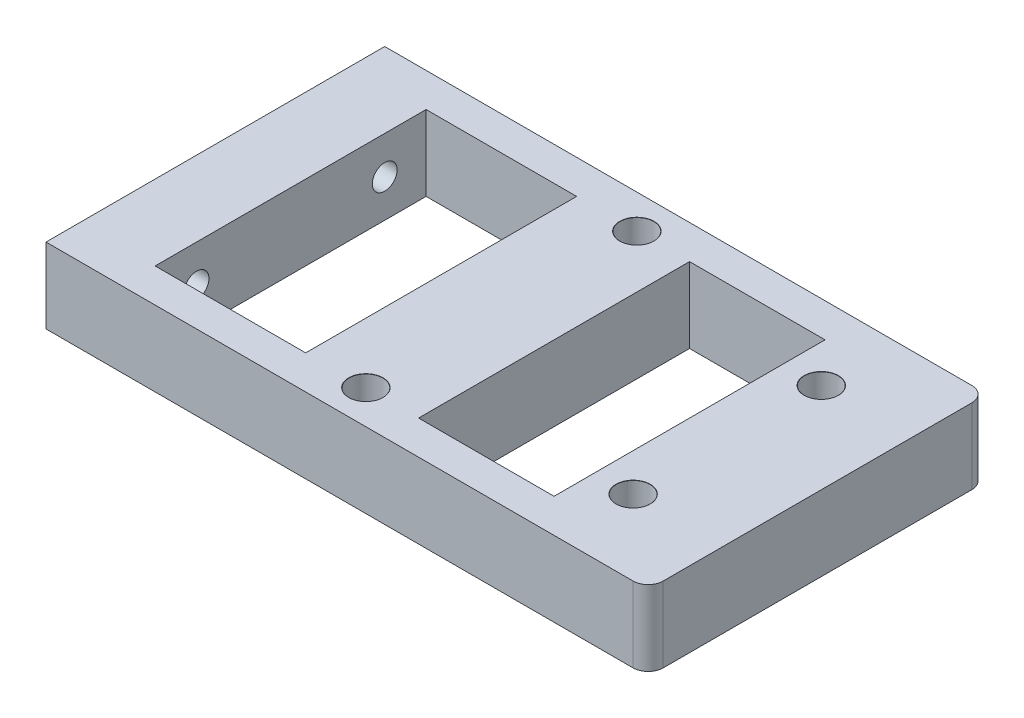
ISO-10303-21;
HEADER;
FILE_DESCRIPTION(('STEP AP214'),'2;1');
FILE_NAME('part.step','',(''),(''),'','','');
FILE_SCHEMA(('AUTOMOTIVE_DESIGN { 1 0 10303 214 1 1 1 1 }'));
ENDSEC;
DATA;
#1=APPLICATION_CONTEXT('core data for automotive mechanical design processes');
#2=APPLICATION_PROTOCOL_DEFINITION('international standard','automotive_design',2000,#1);
#3=PRODUCT_CONTEXT('',#1,'mechanical');
#4=PRODUCT('Part','Part','',(#3));
#5=PRODUCT_RELATED_PRODUCT_CATEGORY('part','',(#4));
#6=PRODUCT_DEFINITION_FORMATION('','',#4);
#7=PRODUCT_DEFINITION_CONTEXT('part definition',#1,'design');
#8=PRODUCT_DEFINITION('design','',#6,#7);
#9=PRODUCT_DEFINITION_SHAPE('','',#8);
#10=(LENGTH_UNIT() NAMED_UNIT(*) SI_UNIT(.MILLI.,.METRE.));
#11=(NAMED_UNIT(*) PLANE_ANGLE_UNIT() SI_UNIT($,.RADIAN.));
#12=(NAMED_UNIT(*) SI_UNIT($,.STERADIAN.) SOLID_ANGLE_UNIT());
#13=UNCERTAINTY_MEASURE_WITH_UNIT(LENGTH_MEASURE(1.E-05),#10,'distance_accuracy_value','');
#14=(GEOMETRIC_REPRESENTATION_CONTEXT(3) GLOBAL_UNCERTAINTY_ASSIGNED_CONTEXT((#13)) GLOBAL_UNIT_ASSIGNED_CONTEXT((#10,
#11,#12)) REPRESENTATION_CONTEXT('',''));
#15=CARTESIAN_POINT('',(0.,0.,0.));
#16=DIRECTION('',(0.,0.,1.));
#17=DIRECTION('',(1.,0.,0.));
#18=AXIS2_PLACEMENT_3D('',#15,#16,#17);
#19=CARTESIAN_POINT('',(0.,10.,0.));
#20=DIRECTION('',(0.,1.,0.));
#21=DIRECTION('',(0.,0.,1.));
#22=AXIS2_PLACEMENT_3D('',#19,#20,#21);
#23=PLANE('',#22);
#24=DIRECTION('',(1.,0.,0.));
#25=VECTOR('',#24,1.);
#26=CARTESIAN_POINT('',(0.,10.,18.));
#27=LINE('',#26,#25);
#28=CARTESIAN_POINT('',(-7.5,10.,18.));
#29=VERTEX_POINT('',#28);
#30=CARTESIAN_POINT('',(10.5,10.,18.));
#31=VERTEX_POINT('',#30);
#32=EDGE_CURVE('E59',#29,#31,#27,.T.);
#33=ORIENTED_EDGE('',*,*,#32,.F.);
#34=DIRECTION('',(0.,0.,-1.));
#35=VECTOR('',#34,1.);
#36=CARTESIAN_POINT('',(-7.5,10.,0.));
#37=LINE('',#36,#35);
#38=CARTESIAN_POINT('',(-7.5,10.,-18.));
#39=VERTEX_POINT('',#38);
#40=EDGE_CURVE('E169',#29,#39,#37,.T.);
#41=ORIENTED_EDGE('',*,*,#40,.T.);
#42=DIRECTION('',(1.,0.,0.));
#43=VECTOR('',#42,1.);
#44=CARTESIAN_POINT('',(0.,10.,-18.));
#45=LINE('',#44,#43);
#46=CARTESIAN_POINT('',(10.5,10.,-18.));
#47=VERTEX_POINT('',#46);
#48=EDGE_CURVE('E174',#39,#47,#45,.T.);
#49=ORIENTED_EDGE('',*,*,#48,.T.);
#50=DIRECTION('',(0.,0.,-1.));
#51=VECTOR('',#50,1.);
#52=CARTESIAN_POINT('',(10.5,10.,0.));
#53=LINE('',#52,#51);
#54=EDGE_CURVE('E183',#31,#47,#53,.T.);
#55=ORIENTED_EDGE('',*,*,#54,.F.);
#56=EDGE_LOOP('',(#33,#41,#49,#55));
#57=FACE_BOUND('',#56,.T.);
#58=CARTESIAN_POINT('',(-14.5,10.,-18.));
#59=DIRECTION('',(0.,1.,0.));
#60=DIRECTION('',(0.,0.,1.));
#61=AXIS2_PLACEMENT_3D('',#58,#59,#60);
#62=CIRCLE('',#61,2.275);
#63=CARTESIAN_POINT('',(-14.5,10.,-15.725));
#64=VERTEX_POINT('',#63);
#65=EDGE_CURVE('E261',#64,#64,#62,.T.);
#66=ORIENTED_EDGE('',*,*,#65,.F.);
#67=EDGE_LOOP('',(#66));
#68=FACE_BOUND('',#67,.T.);
#69=CARTESIAN_POINT('',(15.5,10.,-12.5));
#70=DIRECTION('',(0.,1.,0.));
#71=DIRECTION('',(0.,0.,1.));
#72=AXIS2_PLACEMENT_3D('',#69,#70,#71);
#73=CIRCLE('',#72,2.275);
#74=CARTESIAN_POINT('',(15.5,10.,-10.225));
#75=VERTEX_POINT('',#74);
#76=EDGE_CURVE('E273',#75,#75,#73,.T.);
#77=ORIENTED_EDGE('',*,*,#76,.F.);
#78=EDGE_LOOP('',(#77));
#79=FACE_BOUND('',#78,.T.);
#80=CARTESIAN_POINT('',(15.5,10.,12.5));
#81=DIRECTION('',(0.,1.,0.));
#82=DIRECTION('',(0.,0.,1.));
#83=AXIS2_PLACEMENT_3D('',#80,#81,#82);
#84=CIRCLE('',#83,2.275);
#85=CARTESIAN_POINT('',(15.5,10.,14.775));
#86=VERTEX_POINT('',#85);
#87=EDGE_CURVE('E285',#86,#86,#84,.T.);
#88=ORIENTED_EDGE('',*,*,#87,.F.);
#89=EDGE_LOOP('',(#88));
#90=FACE_BOUND('',#89,.T.);
#91=CARTESIAN_POINT('',(-14.5,10.,18.));
#92=DIRECTION('',(0.,1.,0.));
#93=DIRECTION('',(0.,0.,1.));
#94=AXIS2_PLACEMENT_3D('',#91,#92,#93);
#95=CIRCLE('',#94,2.275);
#96=CARTESIAN_POINT('',(-14.5,10.,20.275));
#97=VERTEX_POINT('',#96);
#98=EDGE_CURVE('E297',#97,#97,#95,.T.);
#99=ORIENTED_EDGE('',*,*,#98,.F.);
#100=EDGE_LOOP('',(#99));
#101=FACE_BOUND('',#100,.T.);
#102=DIRECTION('',(1.,0.,0.));
#103=VECTOR('',#102,1.);
#104=CARTESIAN_POINT('',(-52.5,10.,22.5));
#105=LINE('',#104,#103);
#106=CARTESIAN_POINT('',(-52.5,10.,22.5));
#107=VERTEX_POINT('',#106);
#108=CARTESIAN_POINT('',(25.5,10.,22.5));
#109=VERTEX_POINT('',#108);
#110=EDGE_CURVE('E321',#107,#109,#105,.T.);
#111=ORIENTED_EDGE('',*,*,#110,.T.);
#112=CARTESIAN_POINT('',(25.5,10.,20.5));
#113=DIRECTION('',(0.,1.,0.));
#114=DIRECTION('',(0.,0.,1.));
#115=AXIS2_PLACEMENT_3D('',#112,#113,#114);
#116=CIRCLE('',#115,2.);
#117=CARTESIAN_POINT('',(27.5,10.,20.5));
#118=VERTEX_POINT('',#117);
#119=EDGE_CURVE('E52',#109,#118,#116,.T.);
#120=ORIENTED_EDGE('',*,*,#119,.T.);
#121=DIRECTION('',(0.,0.,-1.));
#122=VECTOR('',#121,1.);
#123=CARTESIAN_POINT('',(27.5,10.,-22.5));
#124=LINE('',#123,#122);
#125=CARTESIAN_POINT('',(27.5,10.,-20.5));
#126=VERTEX_POINT('',#125);
#127=EDGE_CURVE('E310',#118,#126,#124,.T.);
#128=ORIENTED_EDGE('',*,*,#127,.T.);
#129=CARTESIAN_POINT('',(25.5,10.,-20.5));
#130=DIRECTION('',(0.,1.,0.));
#131=DIRECTION('',(0.,0.,1.));
#132=AXIS2_PLACEMENT_3D('',#129,#130,#131);
#133=CIRCLE('',#132,2.);
#134=CARTESIAN_POINT('',(25.5,10.,-22.5));
#135=VERTEX_POINT('',#134);
#136=EDGE_CURVE('E362',#126,#135,#133,.T.);
#137=ORIENTED_EDGE('',*,*,#136,.T.);
#138=DIRECTION('',(-1.,0.,0.));
#139=VECTOR('',#138,1.);
#140=CARTESIAN_POINT('',(-27.5,10.,-22.5));
#141=LINE('',#140,#139);
#142=CARTESIAN_POINT('',(-52.5,10.,-22.5));
#143=VERTEX_POINT('',#142);
#144=EDGE_CURVE('E314',#135,#143,#141,.T.);
#145=ORIENTED_EDGE('',*,*,#144,.T.);
#146=DIRECTION('',(0.,0.,1.));
#147=VECTOR('',#146,1.);
#148=CARTESIAN_POINT('',(-52.5,10.,-22.5));
#149=LINE('',#148,#147);
#150=EDGE_CURVE('E318',#143,#107,#149,.T.);
#151=ORIENTED_EDGE('',*,*,#150,.T.);
#152=EDGE_LOOP('',(#111,#120,#128,#137,#145,#151));
#153=FACE_BOUND('',#152,.T.);
#154=DIRECTION('',(-1.,0.,0.));
#155=VECTOR('',#154,1.);
#156=CARTESIAN_POINT('',(-22.5,10.,-18.));
#157=LINE('',#156,#155);
#158=CARTESIAN_POINT('',(-22.5,10.,-18.));
#159=VERTEX_POINT('',#158);
#160=CARTESIAN_POINT('',(-42.5,10.,-18.));
#161=VERTEX_POINT('',#160);
#162=EDGE_CURVE('E211',#159,#161,#157,.T.);
#163=ORIENTED_EDGE('',*,*,#162,.F.);
#164=DIRECTION('',(0.,0.,1.));
#165=VECTOR('',#164,1.);
#166=CARTESIAN_POINT('',(-22.5,10.,-18.));
#167=LINE('',#166,#165);
#168=CARTESIAN_POINT('',(-22.5,10.,18.));
#169=VERTEX_POINT('',#168);
#170=EDGE_CURVE('E67',#159,#169,#167,.T.);
#171=ORIENTED_EDGE('',*,*,#170,.T.);
#172=DIRECTION('',(-1.,0.,0.));
#173=VECTOR('',#172,1.);
#174=CARTESIAN_POINT('',(-22.5,10.,18.));
#175=LINE('',#174,#173);
#176=CARTESIAN_POINT('',(-42.5,10.,18.));
#177=VERTEX_POINT('',#176);
#178=EDGE_CURVE('E220',#169,#177,#175,.T.);
#179=ORIENTED_EDGE('',*,*,#178,.T.);
#180=DIRECTION('',(0.,0.,1.));
#181=VECTOR('',#180,1.);
#182=CARTESIAN_POINT('',(-42.5,10.,-18.));
#183=LINE('',#182,#181);
#184=EDGE_CURVE('E215',#161,#177,#183,.T.);
#185=ORIENTED_EDGE('',*,*,#184,.F.);
#186=EDGE_LOOP('',(#163,#171,#179,#185));
#187=FACE_BOUND('',#186,.T.);
#188=ADVANCED_FACE('F43',(#57,#68,#79,#90,#101,#153,#187),#23,.T.);
#189=CARTESIAN_POINT('',(0.,0.,0.));
#190=DIRECTION('',(0.,1.,0.));
#191=DIRECTION('',(0.,0.,1.));
#192=AXIS2_PLACEMENT_3D('',#189,#190,#191);
#193=PLANE('',#192);
#194=DIRECTION('',(0.,0.,-1.));
#195=VECTOR('',#194,1.);
#196=CARTESIAN_POINT('',(-7.5,0.,0.));
#197=LINE('',#196,#195);
#198=CARTESIAN_POINT('',(-7.5,0.,18.));
#199=VERTEX_POINT('',#198);
#200=CARTESIAN_POINT('',(-7.5,0.,-18.));
#201=VERTEX_POINT('',#200);
#202=EDGE_CURVE('E155',#199,#201,#197,.T.);
#203=ORIENTED_EDGE('',*,*,#202,.F.);
#204=DIRECTION('',(1.,0.,0.));
#205=VECTOR('',#204,1.);
#206=CARTESIAN_POINT('',(0.,0.,18.));
#207=LINE('',#206,#205);
#208=CARTESIAN_POINT('',(10.5,0.,18.));
#209=VERTEX_POINT('',#208);
#210=EDGE_CURVE('E148',#199,#209,#207,.T.);
#211=ORIENTED_EDGE('',*,*,#210,.T.);
#212=DIRECTION('',(0.,0.,-1.));
#213=VECTOR('',#212,1.);
#214=CARTESIAN_POINT('',(10.5,0.,0.));
#215=LINE('',#214,#213);
#216=CARTESIAN_POINT('',(10.5,0.,-18.));
#217=VERTEX_POINT('',#216);
#218=EDGE_CURVE('E158',#209,#217,#215,.T.);
#219=ORIENTED_EDGE('',*,*,#218,.T.);
#220=DIRECTION('',(1.,0.,0.));
#221=VECTOR('',#220,1.);
#222=CARTESIAN_POINT('',(0.,0.,-18.));
#223=LINE('',#222,#221);
#224=EDGE_CURVE('E164',#201,#217,#223,.T.);
#225=ORIENTED_EDGE('',*,*,#224,.F.);
#226=EDGE_LOOP('',(#203,#211,#219,#225));
#227=FACE_BOUND('',#226,.T.);
#228=DIRECTION('',(0.,0.,-1.));
#229=VECTOR('',#228,1.);
#230=CARTESIAN_POINT('',(27.5,0.,-22.5));
#231=LINE('',#230,#229);
#232=CARTESIAN_POINT('',(27.5,0.,20.5));
#233=VERTEX_POINT('',#232);
#234=CARTESIAN_POINT('',(27.5,0.,-20.5));
#235=VERTEX_POINT('',#234);
#236=EDGE_CURVE('E309',#233,#235,#231,.T.);
#237=ORIENTED_EDGE('',*,*,#236,.F.);
#238=CARTESIAN_POINT('',(25.5,0.,20.5));
#239=DIRECTION('',(0.,1.,0.));
#240=DIRECTION('',(0.,0.,1.));
#241=AXIS2_PLACEMENT_3D('',#238,#239,#240);
#242=CIRCLE('',#241,2.);
#243=CARTESIAN_POINT('',(25.5,0.,22.5));
#244=VERTEX_POINT('',#243);
#245=EDGE_CURVE('E356',#233,#244,#242,.F.);
#246=ORIENTED_EDGE('',*,*,#245,.T.);
#247=DIRECTION('',(1.,0.,0.));
#248=VECTOR('',#247,1.);
#249=CARTESIAN_POINT('',(-27.5,0.,22.5));
#250=LINE('',#249,#248);
#251=CARTESIAN_POINT('',(-52.5,0.,22.5));
#252=VERTEX_POINT('',#251);
#253=EDGE_CURVE('E315',#252,#244,#250,.T.);
#254=ORIENTED_EDGE('',*,*,#253,.F.);
#255=DIRECTION('',(0.,0.,1.));
#256=VECTOR('',#255,1.);
#257=CARTESIAN_POINT('',(-52.5,0.,-22.5));
#258=LINE('',#257,#256);
#259=CARTESIAN_POINT('',(-52.5,0.,-22.5));
#260=VERTEX_POINT('',#259);
#261=EDGE_CURVE('E332',#260,#252,#258,.T.);
#262=ORIENTED_EDGE('',*,*,#261,.F.);
#263=DIRECTION('',(-1.,0.,0.));
#264=VECTOR('',#263,1.);
#265=CARTESIAN_POINT('',(-27.5,0.,-22.5));
#266=LINE('',#265,#264);
#267=CARTESIAN_POINT('',(25.5,0.,-22.5));
#268=VERTEX_POINT('',#267);
#269=EDGE_CURVE('E329',#268,#260,#266,.T.);
#270=ORIENTED_EDGE('',*,*,#269,.F.);
#271=CARTESIAN_POINT('',(25.5,0.,-20.5));
#272=DIRECTION('',(0.,1.,0.));
#273=DIRECTION('',(0.,0.,1.));
#274=AXIS2_PLACEMENT_3D('',#271,#272,#273);
#275=CIRCLE('',#274,2.);
#276=EDGE_CURVE('E353',#268,#235,#275,.F.);
#277=ORIENTED_EDGE('',*,*,#276,.T.);
#278=EDGE_LOOP('',(#237,#246,#254,#262,#270,#277));
#279=FACE_BOUND('',#278,.T.);
#280=CARTESIAN_POINT('',(-14.5,0.,18.));
#281=DIRECTION('',(0.,1.,0.));
#282=DIRECTION('',(0.,0.,1.));
#283=AXIS2_PLACEMENT_3D('',#280,#281,#282);
#284=CIRCLE('',#283,2.25);
#285=CARTESIAN_POINT('',(-14.5,0.,20.25));
#286=VERTEX_POINT('',#285);
#287=EDGE_CURVE('E305',#286,#286,#284,.T.);
#288=ORIENTED_EDGE('',*,*,#287,.T.);
#289=EDGE_LOOP('',(#288));
#290=FACE_BOUND('',#289,.T.);
#291=CARTESIAN_POINT('',(15.5,0.,12.5));
#292=DIRECTION('',(0.,1.,0.));
#293=DIRECTION('',(0.,0.,1.));
#294=AXIS2_PLACEMENT_3D('',#291,#292,#293);
#295=CIRCLE('',#294,2.25);
#296=CARTESIAN_POINT('',(15.5,0.,14.75));
#297=VERTEX_POINT('',#296);
#298=EDGE_CURVE('E293',#297,#297,#295,.T.);
#299=ORIENTED_EDGE('',*,*,#298,.T.);
#300=EDGE_LOOP('',(#299));
#301=FACE_BOUND('',#300,.T.);
#302=CARTESIAN_POINT('',(15.5,0.,-12.5));
#303=DIRECTION('',(0.,1.,0.));
#304=DIRECTION('',(0.,0.,1.));
#305=AXIS2_PLACEMENT_3D('',#302,#303,#304);
#306=CIRCLE('',#305,2.25);
#307=CARTESIAN_POINT('',(15.5,0.,-10.25));
#308=VERTEX_POINT('',#307);
#309=EDGE_CURVE('E281',#308,#308,#306,.T.);
#310=ORIENTED_EDGE('',*,*,#309,.T.);
#311=EDGE_LOOP('',(#310));
#312=FACE_BOUND('',#311,.T.);
#313=CARTESIAN_POINT('',(-14.5,0.,-18.));
#314=DIRECTION('',(0.,1.,0.));
#315=DIRECTION('',(0.,0.,1.));
#316=AXIS2_PLACEMENT_3D('',#313,#314,#315);
#317=CIRCLE('',#316,2.25);
#318=CARTESIAN_POINT('',(-14.5,0.,-15.75));
#319=VERTEX_POINT('',#318);
#320=EDGE_CURVE('E269',#319,#319,#317,.T.);
#321=ORIENTED_EDGE('',*,*,#320,.T.);
#322=EDGE_LOOP('',(#321));
#323=FACE_BOUND('',#322,.T.);
#324=DIRECTION('',(0.,0.,1.));
#325=VECTOR('',#324,1.);
#326=CARTESIAN_POINT('',(-22.5,0.,-18.));
#327=LINE('',#326,#325);
#328=CARTESIAN_POINT('',(-22.5,0.,-18.));
#329=VERTEX_POINT('',#328);
#330=CARTESIAN_POINT('',(-22.5,0.,18.));
#331=VERTEX_POINT('',#330);
#332=EDGE_CURVE('E216',#329,#331,#327,.T.);
#333=ORIENTED_EDGE('',*,*,#332,.F.);
#334=DIRECTION('',(-1.,0.,0.));
#335=VECTOR('',#334,1.);
#336=CARTESIAN_POINT('',(-22.5,0.,-18.));
#337=LINE('',#336,#335);
#338=CARTESIAN_POINT('',(-42.5,0.,-18.));
#339=VERTEX_POINT('',#338);
#340=EDGE_CURVE('E210',#329,#339,#337,.T.);
#341=ORIENTED_EDGE('',*,*,#340,.T.);
#342=DIRECTION('',(0.,0.,1.));
#343=VECTOR('',#342,1.);
#344=CARTESIAN_POINT('',(-42.5,0.,-18.));
#345=LINE('',#344,#343);
#346=CARTESIAN_POINT('',(-42.5,0.,18.));
#347=VERTEX_POINT('',#346);
#348=EDGE_CURVE('E229',#339,#347,#345,.T.);
#349=ORIENTED_EDGE('',*,*,#348,.T.);
#350=DIRECTION('',(-1.,0.,0.));
#351=VECTOR('',#350,1.);
#352=CARTESIAN_POINT('',(-22.5,0.,18.));
#353=LINE('',#352,#351);
#354=EDGE_CURVE('E233',#331,#347,#353,.T.);
#355=ORIENTED_EDGE('',*,*,#354,.F.);
#356=EDGE_LOOP('',(#333,#341,#349,#355));
#357=FACE_BOUND('',#356,.T.);
#358=ADVANCED_FACE('F166',(#227,#279,#290,#301,#312,#323,#357),#193,.F.);
#359=CARTESIAN_POINT('',(27.5,10.,-22.5));
#360=DIRECTION('',(-1.,0.,0.));
#361=DIRECTION('',(0.,0.,1.));
#362=AXIS2_PLACEMENT_3D('',#359,#360,#361);
#363=PLANE('',#362);
#364=ORIENTED_EDGE('',*,*,#127,.F.);
#365=DIRECTION('',(0.,-1.,0.));
#366=VECTOR('',#365,1.);
#367=CARTESIAN_POINT('',(27.5,10.,20.5));
#368=LINE('',#367,#366);
#369=EDGE_CURVE('E349',#118,#233,#368,.T.);
#370=ORIENTED_EDGE('',*,*,#369,.T.);
#371=ORIENTED_EDGE('',*,*,#236,.T.);
#372=DIRECTION('',(0.,-1.,0.));
#373=VECTOR('',#372,1.);
#374=CARTESIAN_POINT('',(27.5,10.,-20.5));
#375=LINE('',#374,#373);
#376=EDGE_CURVE('E346',#235,#126,#375,.F.);
#377=ORIENTED_EDGE('',*,*,#376,.T.);
#378=EDGE_LOOP('',(#364,#370,#371,#377));
#379=FACE_BOUND('',#378,.T.);
#380=ADVANCED_FACE('F376',(#379),#363,.F.);
#381=CARTESIAN_POINT('',(-27.5,10.,-22.5));
#382=DIRECTION('',(0.,0.,1.));
#383=DIRECTION('',(1.,0.,0.));
#384=AXIS2_PLACEMENT_3D('',#381,#382,#383);
#385=PLANE('',#384);
#386=ORIENTED_EDGE('',*,*,#144,.F.);
#387=DIRECTION('',(0.,-1.,0.));
#388=VECTOR('',#387,1.);
#389=CARTESIAN_POINT('',(25.5,10.,-22.5));
#390=LINE('',#389,#388);
#391=EDGE_CURVE('E11',#135,#268,#390,.T.);
#392=ORIENTED_EDGE('',*,*,#391,.T.);
#393=ORIENTED_EDGE('',*,*,#269,.T.);
#394=DIRECTION('',(0.,-1.,0.));
#395=VECTOR('',#394,1.);
#396=CARTESIAN_POINT('',(-52.5,10.,-22.5));
#397=LINE('',#396,#395);
#398=EDGE_CURVE('E342',#143,#260,#397,.T.);
#399=ORIENTED_EDGE('',*,*,#398,.F.);
#400=EDGE_LOOP('',(#386,#392,#393,#399));
#401=FACE_BOUND('',#400,.T.);
#402=ADVANCED_FACE('F392',(#401),#385,.F.);
#403=CARTESIAN_POINT('',(-52.5,10.,-22.5));
#404=DIRECTION('',(1.,0.,0.));
#405=DIRECTION('',(0.,0.,-1.));
#406=AXIS2_PLACEMENT_3D('',#403,#404,#405);
#407=PLANE('',#406);
#408=CARTESIAN_POINT('',(-52.5,5.,12.5));
#409=DIRECTION('',(-1.,0.,0.));
#410=DIRECTION('',(0.,0.,1.));
#411=AXIS2_PLACEMENT_3D('',#408,#409,#410);
#412=CIRCLE('',#411,2.025);
#413=CARTESIAN_POINT('',(-52.5,5.,14.525));
#414=VERTEX_POINT('',#413);
#415=EDGE_CURVE('E245',#414,#414,#412,.T.);
#416=ORIENTED_EDGE('',*,*,#415,.F.);
#417=EDGE_LOOP('',(#416));
#418=FACE_BOUND('',#417,.T.);
#419=CARTESIAN_POINT('',(-52.5,5.,-12.5));
#420=DIRECTION('',(-1.,0.,0.));
#421=DIRECTION('',(0.,0.,1.));
#422=AXIS2_PLACEMENT_3D('',#419,#420,#421);
#423=CIRCLE('',#422,2.025);
#424=CARTESIAN_POINT('',(-52.5,5.,-10.475));
#425=VERTEX_POINT('',#424);
#426=EDGE_CURVE('E253',#425,#425,#423,.T.);
#427=ORIENTED_EDGE('',*,*,#426,.F.);
#428=EDGE_LOOP('',(#427));
#429=FACE_BOUND('',#428,.T.);
#430=ORIENTED_EDGE('',*,*,#261,.T.);
#431=DIRECTION('',(0.,-1.,0.));
#432=VECTOR('',#431,1.);
#433=CARTESIAN_POINT('',(-52.5,10.,22.5));
#434=LINE('',#433,#432);
#435=EDGE_CURVE('E325',#107,#252,#434,.T.);
#436=ORIENTED_EDGE('',*,*,#435,.F.);
#437=ORIENTED_EDGE('',*,*,#150,.F.);
#438=ORIENTED_EDGE('',*,*,#398,.T.);
#439=EDGE_LOOP('',(#430,#436,#437,#438));
#440=FACE_BOUND('',#439,.T.);
#441=ADVANCED_FACE('F387',(#418,#429,#440),#407,.F.);
#442=CARTESIAN_POINT('',(-27.5,10.,22.5));
#443=DIRECTION('',(0.,0.,-1.));
#444=DIRECTION('',(-1.,0.,0.));
#445=AXIS2_PLACEMENT_3D('',#442,#443,#444);
#446=PLANE('',#445);
#447=ORIENTED_EDGE('',*,*,#253,.T.);
#448=DIRECTION('',(0.,-1.,0.));
#449=VECTOR('',#448,1.);
#450=CARTESIAN_POINT('',(25.5,10.,22.5));
#451=LINE('',#450,#449);
#452=EDGE_CURVE('E359',#244,#109,#451,.F.);
#453=ORIENTED_EDGE('',*,*,#452,.T.);
#454=ORIENTED_EDGE('',*,*,#110,.F.);
#455=ORIENTED_EDGE('',*,*,#435,.T.);
#456=EDGE_LOOP('',(#447,#453,#454,#455));
#457=FACE_BOUND('',#456,.T.);
#458=ADVANCED_FACE('F383',(#457),#446,.F.);
#459=CARTESIAN_POINT('',(-14.5,10.,18.));
#460=DIRECTION('',(0.,1.,0.));
#461=DIRECTION('',(0.,0.,1.));
#462=AXIS2_PLACEMENT_3D('',#459,#460,#461);
#463=CYLINDRICAL_SURFACE('',#462,2.25);
#464=ORIENTED_EDGE('',*,*,#287,.F.);
#465=EDGE_LOOP('',(#464));
#466=FACE_BOUND('',#465,.T.);
#467=CARTESIAN_POINT('',(-14.5,9.97902250922057,18.));
#468=DIRECTION('',(0.,1.,0.));
#469=DIRECTION('',(0.,0.,1.));
#470=AXIS2_PLACEMENT_3D('',#467,#468,#469);
#471=CIRCLE('',#470,2.25);
#472=CARTESIAN_POINT('',(-14.5,9.97902250922057,20.25));
#473=VERTEX_POINT('',#472);
#474=EDGE_CURVE('E301',#473,#473,#471,.T.);
#475=ORIENTED_EDGE('',*,*,#474,.T.);
#476=EDGE_LOOP('',(#475));
#477=FACE_BOUND('',#476,.T.);
#478=ADVANCED_FACE('F414',(#466,#477),#463,.F.);
#479=CARTESIAN_POINT('',(-14.5,10.,18.));
#480=DIRECTION('',(0.,1.,0.));
#481=DIRECTION('',(0.,0.,1.));
#482=AXIS2_PLACEMENT_3D('',#479,#480,#481);
#483=CONICAL_SURFACE('',#482,2.275,0.872664625997159);
#484=ORIENTED_EDGE('',*,*,#474,.F.);
#485=EDGE_LOOP('',(#484));
#486=FACE_BOUND('',#485,.T.);
#487=ORIENTED_EDGE('',*,*,#98,.T.);
#488=EDGE_LOOP('',(#487));
#489=FACE_BOUND('',#488,.T.);
#490=ADVANCED_FACE('F575',(#486,#489),#483,.F.);
#491=CARTESIAN_POINT('',(15.5,10.,12.5));
#492=DIRECTION('',(0.,1.,0.));
#493=DIRECTION('',(0.,0.,1.));
#494=AXIS2_PLACEMENT_3D('',#491,#492,#493);
#495=CYLINDRICAL_SURFACE('',#494,2.25);
#496=ORIENTED_EDGE('',*,*,#298,.F.);
#497=EDGE_LOOP('',(#496));
#498=FACE_BOUND('',#497,.T.);
#499=CARTESIAN_POINT('',(15.5,9.97902250922057,12.5));
#500=DIRECTION('',(0.,1.,0.));
#501=DIRECTION('',(0.,0.,1.));
#502=AXIS2_PLACEMENT_3D('',#499,#500,#501);
#503=CIRCLE('',#502,2.25);
#504=CARTESIAN_POINT('',(15.5,9.97902250922057,14.75));
#505=VERTEX_POINT('',#504);
#506=EDGE_CURVE('E289',#505,#505,#503,.T.);
#507=ORIENTED_EDGE('',*,*,#506,.T.);
#508=EDGE_LOOP('',(#507));
#509=FACE_BOUND('',#508,.T.);
#510=ADVANCED_FACE('F572',(#498,#509),#495,.F.);
#511=CARTESIAN_POINT('',(15.5,10.,12.5));
#512=DIRECTION('',(0.,1.,0.));
#513=DIRECTION('',(0.,0.,1.));
#514=AXIS2_PLACEMENT_3D('',#511,#512,#513);
#515=CONICAL_SURFACE('',#514,2.275,0.872664625997159);
#516=ORIENTED_EDGE('',*,*,#506,.F.);
#517=EDGE_LOOP('',(#516));
#518=FACE_BOUND('',#517,.T.);
#519=ORIENTED_EDGE('',*,*,#87,.T.);
#520=EDGE_LOOP('',(#519));
#521=FACE_BOUND('',#520,.T.);
#522=ADVANCED_FACE('F568',(#518,#521),#515,.F.);
#523=CARTESIAN_POINT('',(15.5,10.,-12.5));
#524=DIRECTION('',(0.,1.,0.));
#525=DIRECTION('',(0.,0.,1.));
#526=AXIS2_PLACEMENT_3D('',#523,#524,#525);
#527=CYLINDRICAL_SURFACE('',#526,2.25);
#528=ORIENTED_EDGE('',*,*,#309,.F.);
#529=EDGE_LOOP('',(#528));
#530=FACE_BOUND('',#529,.T.);
#531=CARTESIAN_POINT('',(15.5,9.97902250922057,-12.5));
#532=DIRECTION('',(0.,1.,0.));
#533=DIRECTION('',(0.,0.,1.));
#534=AXIS2_PLACEMENT_3D('',#531,#532,#533);
#535=CIRCLE('',#534,2.25);
#536=CARTESIAN_POINT('',(15.5,9.97902250922057,-10.25));
#537=VERTEX_POINT('',#536);
#538=EDGE_CURVE('E277',#537,#537,#535,.T.);
#539=ORIENTED_EDGE('',*,*,#538,.T.);
#540=EDGE_LOOP('',(#539));
#541=FACE_BOUND('',#540,.T.);
#542=ADVANCED_FACE('F564',(#530,#541),#527,.F.);
#543=CARTESIAN_POINT('',(15.5,10.,-12.5));
#544=DIRECTION('',(0.,1.,0.));
#545=DIRECTION('',(0.,0.,1.));
#546=AXIS2_PLACEMENT_3D('',#543,#544,#545);
#547=CONICAL_SURFACE('',#546,2.275,0.872664625997159);
#548=ORIENTED_EDGE('',*,*,#538,.F.);
#549=EDGE_LOOP('',(#548));
#550=FACE_BOUND('',#549,.T.);
#551=ORIENTED_EDGE('',*,*,#76,.T.);
#552=EDGE_LOOP('',(#551));
#553=FACE_BOUND('',#552,.T.);
#554=ADVANCED_FACE('F560',(#550,#553),#547,.F.);
#555=CARTESIAN_POINT('',(-14.5,10.,-18.));
#556=DIRECTION('',(0.,1.,0.));
#557=DIRECTION('',(0.,0.,1.));
#558=AXIS2_PLACEMENT_3D('',#555,#556,#557);
#559=CYLINDRICAL_SURFACE('',#558,2.25);
#560=ORIENTED_EDGE('',*,*,#320,.F.);
#561=EDGE_LOOP('',(#560));
#562=FACE_BOUND('',#561,.T.);
#563=CARTESIAN_POINT('',(-14.5,9.97902250922057,-18.));
#564=DIRECTION('',(0.,1.,0.));
#565=DIRECTION('',(0.,0.,1.));
#566=AXIS2_PLACEMENT_3D('',#563,#564,#565);
#567=CIRCLE('',#566,2.25);
#568=CARTESIAN_POINT('',(-14.5,9.97902250922057,-15.75));
#569=VERTEX_POINT('',#568);
#570=EDGE_CURVE('E265',#569,#569,#567,.T.);
#571=ORIENTED_EDGE('',*,*,#570,.T.);
#572=EDGE_LOOP('',(#571));
#573=FACE_BOUND('',#572,.T.);
#574=ADVANCED_FACE('F556',(#562,#573),#559,.F.);
#575=CARTESIAN_POINT('',(-14.5,10.,-18.));
#576=DIRECTION('',(0.,1.,0.));
#577=DIRECTION('',(0.,0.,1.));
#578=AXIS2_PLACEMENT_3D('',#575,#576,#577);
#579=CONICAL_SURFACE('',#578,2.275,0.872664625997159);
#580=ORIENTED_EDGE('',*,*,#570,.F.);
#581=EDGE_LOOP('',(#580));
#582=FACE_BOUND('',#581,.T.);
#583=ORIENTED_EDGE('',*,*,#65,.T.);
#584=EDGE_LOOP('',(#583));
#585=FACE_BOUND('',#584,.T.);
#586=ADVANCED_FACE('F552',(#582,#585),#579,.F.);
#587=CARTESIAN_POINT('',(-52.5,5.,-12.5));
#588=DIRECTION('',(-1.,0.,0.));
#589=DIRECTION('',(0.,0.,1.));
#590=AXIS2_PLACEMENT_3D('',#587,#588,#589);
#591=CYLINDRICAL_SURFACE('',#590,1.65);
#592=CARTESIAN_POINT('',(-42.5,5.,-12.5));
#593=DIRECTION('',(-1.,0.,0.));
#594=DIRECTION('',(0.,0.,1.));
#595=AXIS2_PLACEMENT_3D('',#592,#593,#594);
#596=CIRCLE('',#595,1.65);
#597=CARTESIAN_POINT('',(-42.5,5.,-10.85));
#598=VERTEX_POINT('',#597);
#599=EDGE_CURVE('E241',#598,#598,#596,.F.);
#600=ORIENTED_EDGE('',*,*,#599,.T.);
#601=EDGE_LOOP('',(#600));
#602=FACE_BOUND('',#601,.T.);
#603=CARTESIAN_POINT('',(-52.1853376383085,5.,-12.5));
#604=DIRECTION('',(-1.,0.,0.));
#605=DIRECTION('',(0.,0.,1.));
#606=AXIS2_PLACEMENT_3D('',#603,#604,#605);
#607=CIRCLE('',#606,1.65);
#608=CARTESIAN_POINT('',(-52.1853376383085,5.,-10.85));
#609=VERTEX_POINT('',#608);
#610=EDGE_CURVE('E257',#609,#609,#607,.T.);
#611=ORIENTED_EDGE('',*,*,#610,.T.);
#612=EDGE_LOOP('',(#611));
#613=FACE_BOUND('',#612,.T.);
#614=ADVANCED_FACE('F548',(#602,#613),#591,.F.);
#615=CARTESIAN_POINT('',(-52.5,5.,-12.5));
#616=DIRECTION('',(-1.,0.,0.));
#617=DIRECTION('',(0.,0.,1.));
#618=AXIS2_PLACEMENT_3D('',#615,#616,#617);
#619=CONICAL_SURFACE('',#618,2.025,0.872664625997162);
#620=ORIENTED_EDGE('',*,*,#610,.F.);
#621=EDGE_LOOP('',(#620));
#622=FACE_BOUND('',#621,.T.);
#623=ORIENTED_EDGE('',*,*,#426,.T.);
#624=EDGE_LOOP('',(#623));
#625=FACE_BOUND('',#624,.T.);
#626=ADVANCED_FACE('F544',(#622,#625),#619,.F.);
#627=CARTESIAN_POINT('',(-52.5,5.,12.5));
#628=DIRECTION('',(-1.,0.,0.));
#629=DIRECTION('',(0.,0.,1.));
#630=AXIS2_PLACEMENT_3D('',#627,#628,#629);
#631=CYLINDRICAL_SURFACE('',#630,1.65);
#632=CARTESIAN_POINT('',(-42.5,5.,12.5));
#633=DIRECTION('',(-1.,0.,0.));
#634=DIRECTION('',(0.,0.,1.));
#635=AXIS2_PLACEMENT_3D('',#632,#633,#634);
#636=CIRCLE('',#635,1.65);
#637=CARTESIAN_POINT('',(-42.5,5.,14.15));
#638=VERTEX_POINT('',#637);
#639=EDGE_CURVE('E192',#638,#638,#636,.F.);
#640=ORIENTED_EDGE('',*,*,#639,.T.);
#641=EDGE_LOOP('',(#640));
#642=FACE_BOUND('',#641,.T.);
#643=CARTESIAN_POINT('',(-52.1853376383085,5.,12.5));
#644=DIRECTION('',(-1.,0.,0.));
#645=DIRECTION('',(0.,0.,1.));
#646=AXIS2_PLACEMENT_3D('',#643,#644,#645);
#647=CIRCLE('',#646,1.65);
#648=CARTESIAN_POINT('',(-52.1853376383085,5.,14.15));
#649=VERTEX_POINT('',#648);
#650=EDGE_CURVE('E249',#649,#649,#647,.T.);
#651=ORIENTED_EDGE('',*,*,#650,.T.);
#652=EDGE_LOOP('',(#651));
#653=FACE_BOUND('',#652,.T.);
#654=ADVANCED_FACE('F541',(#642,#653),#631,.F.);
#655=CARTESIAN_POINT('',(-52.5,5.,12.5));
#656=DIRECTION('',(-1.,0.,0.));
#657=DIRECTION('',(0.,0.,1.));
#658=AXIS2_PLACEMENT_3D('',#655,#656,#657);
#659=CONICAL_SURFACE('',#658,2.025,0.872664625997162);
#660=ORIENTED_EDGE('',*,*,#650,.F.);
#661=EDGE_LOOP('',(#660));
#662=FACE_BOUND('',#661,.T.);
#663=ORIENTED_EDGE('',*,*,#415,.T.);
#664=EDGE_LOOP('',(#663));
#665=FACE_BOUND('',#664,.T.);
#666=ADVANCED_FACE('F405',(#662,#665),#659,.F.);
#667=CARTESIAN_POINT('',(25.5,10.,20.5));
#668=DIRECTION('',(0.,-1.,0.));
#669=DIRECTION('',(0.,0.,-1.));
#670=AXIS2_PLACEMENT_3D('',#667,#668,#669);
#671=CYLINDRICAL_SURFACE('',#670,2.);
#672=ORIENTED_EDGE('',*,*,#119,.F.);
#673=ORIENTED_EDGE('',*,*,#452,.F.);
#674=ORIENTED_EDGE('',*,*,#245,.F.);
#675=ORIENTED_EDGE('',*,*,#369,.F.);
#676=EDGE_LOOP('',(#672,#673,#674,#675));
#677=FACE_BOUND('',#676,.T.);
#678=ADVANCED_FACE('F379',(#677),#671,.T.);
#679=CARTESIAN_POINT('',(25.5,10.,-20.5));
#680=DIRECTION('',(0.,-1.,0.));
#681=DIRECTION('',(0.,0.,-1.));
#682=AXIS2_PLACEMENT_3D('',#679,#680,#681);
#683=CYLINDRICAL_SURFACE('',#682,2.);
#684=ORIENTED_EDGE('',*,*,#136,.F.);
#685=ORIENTED_EDGE('',*,*,#376,.F.);
#686=ORIENTED_EDGE('',*,*,#276,.F.);
#687=ORIENTED_EDGE('',*,*,#391,.F.);
#688=EDGE_LOOP('',(#684,#685,#686,#687));
#689=FACE_BOUND('',#688,.T.);
#690=ADVANCED_FACE('F45',(#689),#683,.T.);
#691=CARTESIAN_POINT('',(-42.5,0.,-18.));
#692=DIRECTION('',(-1.,0.,0.));
#693=DIRECTION('',(0.,0.,1.));
#694=AXIS2_PLACEMENT_3D('',#691,#692,#693);
#695=PLANE('',#694);
#696=ORIENTED_EDGE('',*,*,#639,.F.);
#697=EDGE_LOOP('',(#696));
#698=FACE_BOUND('',#697,.T.);
#699=ORIENTED_EDGE('',*,*,#184,.T.);
#700=DIRECTION('',(0.,1.,0.));
#701=VECTOR('',#700,1.);
#702=CARTESIAN_POINT('',(-42.5,0.,18.));
#703=LINE('',#702,#701);
#704=EDGE_CURVE('E201',#347,#177,#703,.T.);
#705=ORIENTED_EDGE('',*,*,#704,.F.);
#706=ORIENTED_EDGE('',*,*,#348,.F.);
#707=DIRECTION('',(0.,1.,0.));
#708=VECTOR('',#707,1.);
#709=CARTESIAN_POINT('',(-42.5,0.,-18.));
#710=LINE('',#709,#708);
#711=EDGE_CURVE('E204',#339,#161,#710,.T.);
#712=ORIENTED_EDGE('',*,*,#711,.T.);
#713=EDGE_LOOP('',(#699,#705,#706,#712));
#714=FACE_BOUND('',#713,.T.);
#715=ORIENTED_EDGE('',*,*,#599,.F.);
#716=EDGE_LOOP('',(#715));
#717=FACE_BOUND('',#716,.T.);
#718=ADVANCED_FACE('F396',(#698,#714,#717),#695,.F.);
#719=CARTESIAN_POINT('',(-22.5,0.,-18.));
#720=DIRECTION('',(-1.,0.,0.));
#721=DIRECTION('',(0.,0.,1.));
#722=AXIS2_PLACEMENT_3D('',#719,#720,#721);
#723=PLANE('',#722);
#724=ORIENTED_EDGE('',*,*,#170,.F.);
#725=DIRECTION('',(0.,1.,0.));
#726=VECTOR('',#725,1.);
#727=CARTESIAN_POINT('',(-22.5,0.,-18.));
#728=LINE('',#727,#726);
#729=EDGE_CURVE('E207',#329,#159,#728,.T.);
#730=ORIENTED_EDGE('',*,*,#729,.F.);
#731=ORIENTED_EDGE('',*,*,#332,.T.);
#732=DIRECTION('',(0.,1.,0.));
#733=VECTOR('',#732,1.);
#734=CARTESIAN_POINT('',(-22.5,0.,18.));
#735=LINE('',#734,#733);
#736=EDGE_CURVE('E198',#331,#169,#735,.T.);
#737=ORIENTED_EDGE('',*,*,#736,.T.);
#738=EDGE_LOOP('',(#724,#730,#731,#737));
#739=FACE_BOUND('',#738,.T.);
#740=ADVANCED_FACE('F402',(#739),#723,.T.);
#741=CARTESIAN_POINT('',(-22.5,0.,18.));
#742=DIRECTION('',(0.,0.,-1.));
#743=DIRECTION('',(-1.,0.,0.));
#744=AXIS2_PLACEMENT_3D('',#741,#742,#743);
#745=PLANE('',#744);
#746=ORIENTED_EDGE('',*,*,#178,.F.);
#747=ORIENTED_EDGE('',*,*,#736,.F.);
#748=ORIENTED_EDGE('',*,*,#354,.T.);
#749=ORIENTED_EDGE('',*,*,#704,.T.);
#750=EDGE_LOOP('',(#746,#747,#748,#749));
#751=FACE_BOUND('',#750,.T.);
#752=ADVANCED_FACE('F481',(#751),#745,.T.);
#753=CARTESIAN_POINT('',(-22.5,0.,-18.));
#754=DIRECTION('',(0.,0.,-1.));
#755=DIRECTION('',(-1.,0.,0.));
#756=AXIS2_PLACEMENT_3D('',#753,#754,#755);
#757=PLANE('',#756);
#758=ORIENTED_EDGE('',*,*,#162,.T.);
#759=ORIENTED_EDGE('',*,*,#711,.F.);
#760=ORIENTED_EDGE('',*,*,#340,.F.);
#761=ORIENTED_EDGE('',*,*,#729,.T.);
#762=EDGE_LOOP('',(#758,#759,#760,#761));
#763=FACE_BOUND('',#762,.T.);
#764=ADVANCED_FACE('F490',(#763),#757,.F.);
#765=CARTESIAN_POINT('',(0.,0.,18.));
#766=DIRECTION('',(0.,0.,1.));
#767=DIRECTION('',(1.,0.,0.));
#768=AXIS2_PLACEMENT_3D('',#765,#766,#767);
#769=PLANE('',#768);
#770=ORIENTED_EDGE('',*,*,#32,.T.);
#771=DIRECTION('',(0.,1.,0.));
#772=VECTOR('',#771,1.);
#773=CARTESIAN_POINT('',(10.5,0.,18.));
#774=LINE('',#773,#772);
#775=EDGE_CURVE('E144',#209,#31,#774,.T.);
#776=ORIENTED_EDGE('',*,*,#775,.F.);
#777=ORIENTED_EDGE('',*,*,#210,.F.);
#778=DIRECTION('',(0.,1.,0.));
#779=VECTOR('',#778,1.);
#780=CARTESIAN_POINT('',(-7.5,0.,18.));
#781=LINE('',#780,#779);
#782=EDGE_CURVE('E189',#199,#29,#781,.T.);
#783=ORIENTED_EDGE('',*,*,#782,.T.);
#784=EDGE_LOOP('',(#770,#776,#777,#783));
#785=FACE_BOUND('',#784,.T.);
#786=ADVANCED_FACE('F146',(#785),#769,.F.);
#787=CARTESIAN_POINT('',(-7.5,0.,0.));
#788=DIRECTION('',(1.,0.,0.));
#789=DIRECTION('',(0.,0.,-1.));
#790=AXIS2_PLACEMENT_3D('',#787,#788,#789);
#791=PLANE('',#790);
#792=ORIENTED_EDGE('',*,*,#40,.F.);
#793=ORIENTED_EDGE('',*,*,#782,.F.);
#794=ORIENTED_EDGE('',*,*,#202,.T.);
#795=DIRECTION('',(0.,1.,0.));
#796=VECTOR('',#795,1.);
#797=CARTESIAN_POINT('',(-7.5,0.,-18.));
#798=LINE('',#797,#796);
#799=EDGE_CURVE('E193',#201,#39,#798,.T.);
#800=ORIENTED_EDGE('',*,*,#799,.T.);
#801=EDGE_LOOP('',(#792,#793,#794,#800));
#802=FACE_BOUND('',#801,.T.);
#803=ADVANCED_FACE('F509',(#802),#791,.T.);
#804=CARTESIAN_POINT('',(0.,0.,-18.));
#805=DIRECTION('',(0.,0.,1.));
#806=DIRECTION('',(1.,0.,0.));
#807=AXIS2_PLACEMENT_3D('',#804,#805,#806);
#808=PLANE('',#807);
#809=ORIENTED_EDGE('',*,*,#48,.F.);
#810=ORIENTED_EDGE('',*,*,#799,.F.);
#811=ORIENTED_EDGE('',*,*,#224,.T.);
#812=DIRECTION('',(0.,1.,0.));
#813=VECTOR('',#812,1.);
#814=CARTESIAN_POINT('',(10.5,0.,-18.));
#815=LINE('',#814,#813);
#816=EDGE_CURVE('E154',#217,#47,#815,.T.);
#817=ORIENTED_EDGE('',*,*,#816,.T.);
#818=EDGE_LOOP('',(#809,#810,#811,#817));
#819=FACE_BOUND('',#818,.T.);
#820=ADVANCED_FACE('F518',(#819),#808,.T.);
#821=CARTESIAN_POINT('',(10.5,0.,0.));
#822=DIRECTION('',(1.,0.,0.));
#823=DIRECTION('',(0.,0.,-1.));
#824=AXIS2_PLACEMENT_3D('',#821,#822,#823);
#825=PLANE('',#824);
#826=ORIENTED_EDGE('',*,*,#54,.T.);
#827=ORIENTED_EDGE('',*,*,#816,.F.);
#828=ORIENTED_EDGE('',*,*,#218,.F.);
#829=ORIENTED_EDGE('',*,*,#775,.T.);
#830=EDGE_LOOP('',(#826,#827,#828,#829));
#831=FACE_BOUND('',#830,.T.);
#832=ADVANCED_FACE('F159',(#831),#825,.F.);
#833=CLOSED_SHELL('',(#188,#358,#380,#402,#441,#458,#478,#490,#510,#522,#542,#554,#574,#586,
#614,#626,#654,#666,#678,#690,#718,#740,#752,#764,#786,#803,#820,#832));
#834=MANIFOLD_SOLID_BREP('B2',#833);
#835=ADVANCED_BREP_SHAPE_REPRESENTATION('',(#18,#834),#14);
#836=SHAPE_DEFINITION_REPRESENTATION(#9,#835);
ENDSEC;
END-ISO-10303-21;
